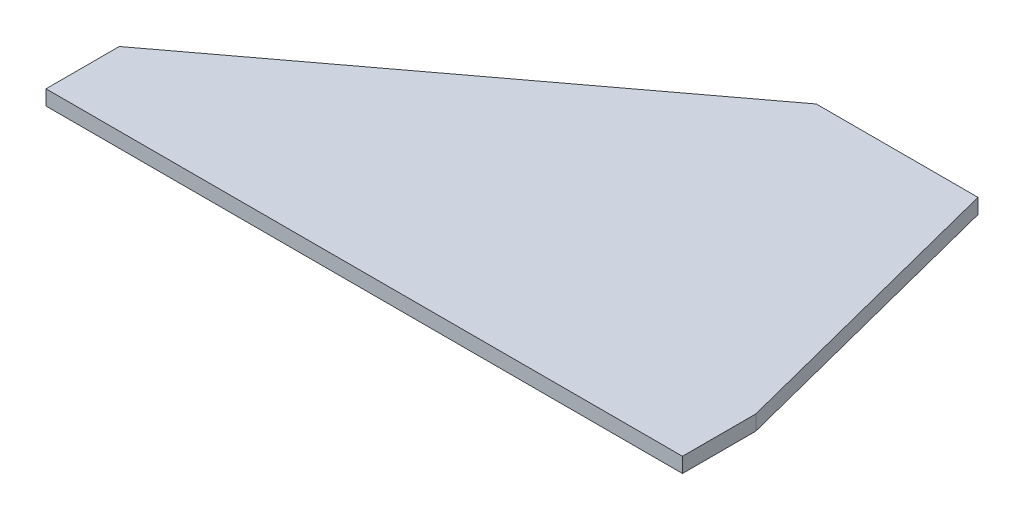
ISO-10303-21;
HEADER;
FILE_DESCRIPTION(('STEP AP214'),'2;1');
FILE_NAME('part.step','',(''),(''),'','','');
FILE_SCHEMA(('AUTOMOTIVE_DESIGN { 1 0 10303 214 1 1 1 1 }'));
ENDSEC;
DATA;
#1=APPLICATION_CONTEXT('core data for automotive mechanical design processes');
#2=APPLICATION_PROTOCOL_DEFINITION('international standard','automotive_design',2000,#1);
#3=PRODUCT_CONTEXT('',#1,'mechanical');
#4=PRODUCT('Part','Part','',(#3));
#5=PRODUCT_RELATED_PRODUCT_CATEGORY('part','',(#4));
#6=PRODUCT_DEFINITION_FORMATION('','',#4);
#7=PRODUCT_DEFINITION_CONTEXT('part definition',#1,'design');
#8=PRODUCT_DEFINITION('design','',#6,#7);
#9=PRODUCT_DEFINITION_SHAPE('','',#8);
#10=(LENGTH_UNIT() NAMED_UNIT(*) SI_UNIT(.MILLI.,.METRE.));
#11=(NAMED_UNIT(*) PLANE_ANGLE_UNIT() SI_UNIT($,.RADIAN.));
#12=(NAMED_UNIT(*) SI_UNIT($,.STERADIAN.) SOLID_ANGLE_UNIT());
#13=UNCERTAINTY_MEASURE_WITH_UNIT(LENGTH_MEASURE(1.E-05),#10,'distance_accuracy_value','');
#14=(GEOMETRIC_REPRESENTATION_CONTEXT(3) GLOBAL_UNCERTAINTY_ASSIGNED_CONTEXT((#13)) GLOBAL_UNIT_ASSIGNED_CONTEXT((#10,
#11,#12)) REPRESENTATION_CONTEXT('',''));
#15=CARTESIAN_POINT('',(0.,0.,0.));
#16=DIRECTION('',(0.,0.,1.));
#17=DIRECTION('',(1.,0.,0.));
#18=AXIS2_PLACEMENT_3D('',#15,#16,#17);
#19=CARTESIAN_POINT('',(127.,-2.38125,-118.618));
#20=DIRECTION('',(0.,0.,1.));
#21=DIRECTION('',(1.,0.,0.));
#22=AXIS2_PLACEMENT_3D('',#19,#20,#21);
#23=PLANE('',#22);
#24=DIRECTION('',(0.,1.,0.));
#25=VECTOR('',#24,1.);
#26=CARTESIAN_POINT('',(127.,-2.38125,-118.618));
#27=LINE('',#26,#25);
#28=CARTESIAN_POINT('',(127.,-2.38125,-118.618));
#29=VERTEX_POINT('',#28);
#30=CARTESIAN_POINT('',(127.,2.38125,-118.618));
#31=VERTEX_POINT('',#30);
#32=EDGE_CURVE('E109',#29,#31,#27,.T.);
#33=ORIENTED_EDGE('',*,*,#32,.T.);
#34=DIRECTION('',(1.,0.,0.));
#35=VECTOR('',#34,1.);
#36=CARTESIAN_POINT('',(127.,2.38125,-118.618));
#37=LINE('',#36,#35);
#38=CARTESIAN_POINT('',(178.562,2.38125,-118.618));
#39=VERTEX_POINT('',#38);
#40=EDGE_CURVE('E102',#31,#39,#37,.T.);
#41=ORIENTED_EDGE('',*,*,#40,.T.);
#42=DIRECTION('',(0.,1.,0.));
#43=VECTOR('',#42,1.);
#44=CARTESIAN_POINT('',(178.562,-2.38125,-118.618));
#45=LINE('',#44,#43);
#46=CARTESIAN_POINT('',(178.562,-2.38125,-118.618));
#47=VERTEX_POINT('',#46);
#48=EDGE_CURVE('E11',#47,#39,#45,.T.);
#49=ORIENTED_EDGE('',*,*,#48,.F.);
#50=DIRECTION('',(1.,0.,0.));
#51=VECTOR('',#50,1.);
#52=CARTESIAN_POINT('',(127.,-2.38125,-118.618));
#53=LINE('',#52,#51);
#54=EDGE_CURVE('E127',#29,#47,#53,.T.);
#55=ORIENTED_EDGE('',*,*,#54,.F.);
#56=EDGE_LOOP('',(#33,#41,#49,#55));
#57=FACE_BOUND('',#56,.T.);
#58=ADVANCED_FACE('F37',(#57),#23,.F.);
#59=CARTESIAN_POINT('',(178.562,-2.38125,-118.618));
#60=DIRECTION('',(-0.968759415176318,0.,0.248002410285137));
#61=DIRECTION('',(0.248002410285137,0.,0.968759415176318));
#62=AXIS2_PLACEMENT_3D('',#59,#60,#61);
#63=PLANE('',#62);
#64=ORIENTED_EDGE('',*,*,#48,.T.);
#65=DIRECTION('',(0.248002410285137,0.,0.968759415176318));
#66=VECTOR('',#65,1.);
#67=CARTESIAN_POINT('',(178.562,2.38125,-118.618));
#68=LINE('',#67,#66);
#69=CARTESIAN_POINT('',(202.946,2.38125,-23.368));
#70=VERTEX_POINT('',#69);
#71=EDGE_CURVE('E92',#39,#70,#68,.T.);
#72=ORIENTED_EDGE('',*,*,#71,.T.);
#73=DIRECTION('',(0.,1.,0.));
#74=VECTOR('',#73,1.);
#75=CARTESIAN_POINT('',(202.946,-2.38125,-23.368));
#76=LINE('',#75,#74);
#77=CARTESIAN_POINT('',(202.946,-2.38125,-23.368));
#78=VERTEX_POINT('',#77);
#79=EDGE_CURVE('E45',#78,#70,#76,.T.);
#80=ORIENTED_EDGE('',*,*,#79,.F.);
#81=DIRECTION('',(0.248002410285137,0.,0.968759415176318));
#82=VECTOR('',#81,1.);
#83=CARTESIAN_POINT('',(178.562,-2.38125,-118.618));
#84=LINE('',#83,#82);
#85=EDGE_CURVE('E93',#47,#78,#84,.T.);
#86=ORIENTED_EDGE('',*,*,#85,.F.);
#87=EDGE_LOOP('',(#64,#72,#80,#86));
#88=FACE_BOUND('',#87,.T.);
#89=ADVANCED_FACE('F90',(#88),#63,.F.);
#90=CARTESIAN_POINT('',(202.946,-2.38125,-23.368));
#91=DIRECTION('',(-1.,0.,0.));
#92=DIRECTION('',(0.,0.,1.));
#93=AXIS2_PLACEMENT_3D('',#90,#91,#92);
#94=PLANE('',#93);
#95=ORIENTED_EDGE('',*,*,#79,.T.);
#96=DIRECTION('',(0.,0.,1.));
#97=VECTOR('',#96,1.);
#98=CARTESIAN_POINT('',(202.946,2.38125,-23.368));
#99=LINE('',#98,#97);
#100=CARTESIAN_POINT('',(202.946,2.38125,0.));
#101=VERTEX_POINT('',#100);
#102=EDGE_CURVE('E106',#70,#101,#99,.T.);
#103=ORIENTED_EDGE('',*,*,#102,.T.);
#104=DIRECTION('',(0.,1.,0.));
#105=VECTOR('',#104,1.);
#106=CARTESIAN_POINT('',(202.946,-2.38125,0.));
#107=LINE('',#106,#105);
#108=CARTESIAN_POINT('',(202.946,-2.38125,0.));
#109=VERTEX_POINT('',#108);
#110=EDGE_CURVE('E150',#109,#101,#107,.T.);
#111=ORIENTED_EDGE('',*,*,#110,.F.);
#112=DIRECTION('',(0.,0.,1.));
#113=VECTOR('',#112,1.);
#114=CARTESIAN_POINT('',(202.946,-2.38125,-23.368));
#115=LINE('',#114,#113);
#116=EDGE_CURVE('E132',#78,#109,#115,.T.);
#117=ORIENTED_EDGE('',*,*,#116,.F.);
#118=EDGE_LOOP('',(#95,#103,#111,#117));
#119=FACE_BOUND('',#118,.T.);
#120=ADVANCED_FACE('F156',(#119),#94,.F.);
#121=CARTESIAN_POINT('',(202.946,-2.38125,0.));
#122=DIRECTION('',(0.,0.,-1.));
#123=DIRECTION('',(-1.,0.,0.));
#124=AXIS2_PLACEMENT_3D('',#121,#122,#123);
#125=PLANE('',#124);
#126=ORIENTED_EDGE('',*,*,#110,.T.);
#127=DIRECTION('',(-1.,0.,0.));
#128=VECTOR('',#127,1.);
#129=CARTESIAN_POINT('',(202.946,2.38125,0.));
#130=LINE('',#129,#128);
#131=CARTESIAN_POINT('',(0.,2.38125,0.));
#132=VERTEX_POINT('',#131);
#133=EDGE_CURVE('E116',#101,#132,#130,.T.);
#134=ORIENTED_EDGE('',*,*,#133,.T.);
#135=DIRECTION('',(0.,1.,0.));
#136=VECTOR('',#135,1.);
#137=CARTESIAN_POINT('',(0.,-2.38125,0.));
#138=LINE('',#137,#136);
#139=CARTESIAN_POINT('',(0.,-2.38125,0.));
#140=VERTEX_POINT('',#139);
#141=EDGE_CURVE('E147',#140,#132,#138,.T.);
#142=ORIENTED_EDGE('',*,*,#141,.F.);
#143=DIRECTION('',(-1.,0.,0.));
#144=VECTOR('',#143,1.);
#145=CARTESIAN_POINT('',(202.946,-2.38125,0.));
#146=LINE('',#145,#144);
#147=EDGE_CURVE('E135',#109,#140,#146,.T.);
#148=ORIENTED_EDGE('',*,*,#147,.F.);
#149=EDGE_LOOP('',(#126,#134,#142,#148));
#150=FACE_BOUND('',#149,.T.);
#151=ADVANCED_FACE('F162',(#150),#125,.F.);
#152=CARTESIAN_POINT('',(0.,-2.38125,0.));
#153=DIRECTION('',(1.,0.,0.));
#154=DIRECTION('',(0.,0.,-1.));
#155=AXIS2_PLACEMENT_3D('',#152,#153,#154);
#156=PLANE('',#155);
#157=ORIENTED_EDGE('',*,*,#141,.T.);
#158=DIRECTION('',(0.,0.,-1.));
#159=VECTOR('',#158,1.);
#160=CARTESIAN_POINT('',(0.,2.38125,0.));
#161=LINE('',#160,#159);
#162=CARTESIAN_POINT('',(0.,2.38125,-23.368));
#163=VERTEX_POINT('',#162);
#164=EDGE_CURVE('E120',#132,#163,#161,.T.);
#165=ORIENTED_EDGE('',*,*,#164,.T.);
#166=DIRECTION('',(0.,1.,0.));
#167=VECTOR('',#166,1.);
#168=CARTESIAN_POINT('',(0.,-2.38125,-23.368));
#169=LINE('',#168,#167);
#170=CARTESIAN_POINT('',(0.,-2.38125,-23.368));
#171=VERTEX_POINT('',#170);
#172=EDGE_CURVE('E144',#171,#163,#169,.T.);
#173=ORIENTED_EDGE('',*,*,#172,.F.);
#174=DIRECTION('',(0.,0.,-1.));
#175=VECTOR('',#174,1.);
#176=CARTESIAN_POINT('',(0.,-2.38125,0.));
#177=LINE('',#176,#175);
#178=EDGE_CURVE('E57',#140,#171,#177,.T.);
#179=ORIENTED_EDGE('',*,*,#178,.F.);
#180=EDGE_LOOP('',(#157,#165,#173,#179));
#181=FACE_BOUND('',#180,.T.);
#182=ADVANCED_FACE('F165',(#181),#156,.F.);
#183=CARTESIAN_POINT('',(0.,-2.38125,-23.368));
#184=DIRECTION('',(0.6,0.,0.8));
#185=DIRECTION('',(0.8,0.,-0.6));
#186=AXIS2_PLACEMENT_3D('',#183,#184,#185);
#187=PLANE('',#186);
#188=ORIENTED_EDGE('',*,*,#172,.T.);
#189=DIRECTION('',(0.8,0.,-0.6));
#190=VECTOR('',#189,1.);
#191=CARTESIAN_POINT('',(0.,2.38125,-23.368));
#192=LINE('',#191,#190);
#193=EDGE_CURVE('E124',#163,#31,#192,.T.);
#194=ORIENTED_EDGE('',*,*,#193,.T.);
#195=ORIENTED_EDGE('',*,*,#32,.F.);
#196=DIRECTION('',(0.8,0.,-0.6));
#197=VECTOR('',#196,1.);
#198=CARTESIAN_POINT('',(0.,-2.38125,-23.368));
#199=LINE('',#198,#197);
#200=EDGE_CURVE('E52',#171,#29,#199,.T.);
#201=ORIENTED_EDGE('',*,*,#200,.F.);
#202=EDGE_LOOP('',(#188,#194,#195,#201));
#203=FACE_BOUND('',#202,.T.);
#204=ADVANCED_FACE('F167',(#203),#187,.F.);
#205=CARTESIAN_POINT('',(0.,-2.38125,0.));
#206=DIRECTION('',(0.,-1.,0.));
#207=DIRECTION('',(0.,0.,-1.));
#208=AXIS2_PLACEMENT_3D('',#205,#206,#207);
#209=PLANE('',#208);
#210=ORIENTED_EDGE('',*,*,#54,.T.);
#211=ORIENTED_EDGE('',*,*,#85,.T.);
#212=ORIENTED_EDGE('',*,*,#116,.T.);
#213=ORIENTED_EDGE('',*,*,#147,.T.);
#214=ORIENTED_EDGE('',*,*,#178,.T.);
#215=ORIENTED_EDGE('',*,*,#200,.T.);
#216=EDGE_LOOP('',(#210,#211,#212,#213,#214,#215));
#217=FACE_BOUND('',#216,.T.);
#218=ADVANCED_FACE('F159',(#217),#209,.T.);
#219=CARTESIAN_POINT('',(0.,2.38125,0.));
#220=DIRECTION('',(0.,-1.,0.));
#221=DIRECTION('',(0.,0.,-1.));
#222=AXIS2_PLACEMENT_3D('',#219,#220,#221);
#223=PLANE('',#222);
#224=ORIENTED_EDGE('',*,*,#40,.F.);
#225=ORIENTED_EDGE('',*,*,#193,.F.);
#226=ORIENTED_EDGE('',*,*,#164,.F.);
#227=ORIENTED_EDGE('',*,*,#133,.F.);
#228=ORIENTED_EDGE('',*,*,#102,.F.);
#229=ORIENTED_EDGE('',*,*,#71,.F.);
#230=EDGE_LOOP('',(#224,#225,#226,#227,#228,#229));
#231=FACE_BOUND('',#230,.T.);
#232=ADVANCED_FACE('F100',(#231),#223,.F.);
#233=CLOSED_SHELL('',(#58,#89,#120,#151,#182,#204,#218,#232));
#234=MANIFOLD_SOLID_BREP('B2',#233);
#235=ADVANCED_BREP_SHAPE_REPRESENTATION('',(#18,#234),#14);
#236=SHAPE_DEFINITION_REPRESENTATION(#9,#235);
ENDSEC;
END-ISO-10303-21;
